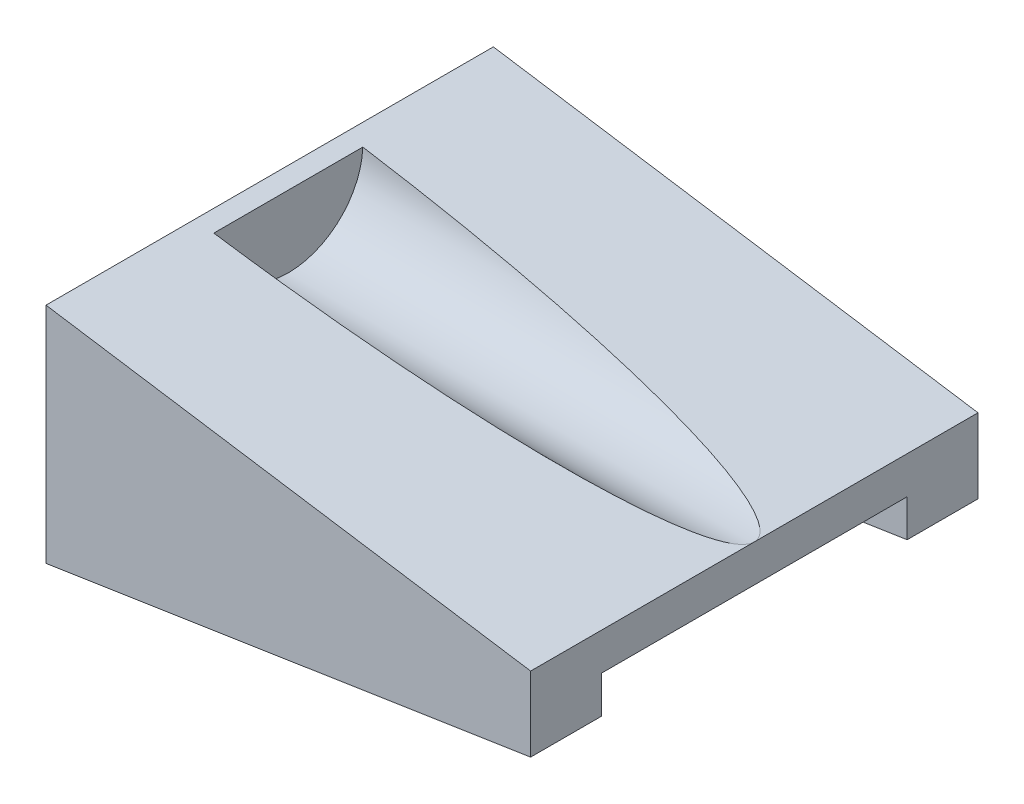
ISO-10303-21;
HEADER;
FILE_DESCRIPTION(('STEP AP214'),'2;1');
FILE_NAME('part.step','',(''),(''),'','','');
FILE_SCHEMA(('AUTOMOTIVE_DESIGN { 1 0 10303 214 1 1 1 1 }'));
ENDSEC;
DATA;
#1=APPLICATION_CONTEXT('core data for automotive mechanical design processes');
#2=APPLICATION_PROTOCOL_DEFINITION('international standard','automotive_design',2000,#1);
#3=PRODUCT_CONTEXT('',#1,'mechanical');
#4=PRODUCT('Part','Part','',(#3));
#5=PRODUCT_RELATED_PRODUCT_CATEGORY('part','',(#4));
#6=PRODUCT_DEFINITION_FORMATION('','',#4);
#7=PRODUCT_DEFINITION_CONTEXT('part definition',#1,'design');
#8=PRODUCT_DEFINITION('design','',#6,#7);
#9=PRODUCT_DEFINITION_SHAPE('','',#8);
#10=(LENGTH_UNIT() NAMED_UNIT(*) SI_UNIT(.MILLI.,.METRE.));
#11=(NAMED_UNIT(*) PLANE_ANGLE_UNIT() SI_UNIT($,.RADIAN.));
#12=(NAMED_UNIT(*) SI_UNIT($,.STERADIAN.) SOLID_ANGLE_UNIT());
#13=UNCERTAINTY_MEASURE_WITH_UNIT(LENGTH_MEASURE(1.E-05),#10,'distance_accuracy_value','');
#14=(GEOMETRIC_REPRESENTATION_CONTEXT(3) GLOBAL_UNCERTAINTY_ASSIGNED_CONTEXT((#13)) GLOBAL_UNIT_ASSIGNED_CONTEXT((#10,
#11,#12)) REPRESENTATION_CONTEXT('',''));
#15=CARTESIAN_POINT('',(0.,0.,0.));
#16=DIRECTION('',(0.,0.,1.));
#17=DIRECTION('',(1.,0.,0.));
#18=AXIS2_PLACEMENT_3D('',#15,#16,#17);
#19=CARTESIAN_POINT('',(0.,0.,0.));
#20=DIRECTION('',(0.,-1.,0.));
#21=DIRECTION('',(0.,0.,-1.));
#22=AXIS2_PLACEMENT_3D('',#19,#20,#21);
#23=PLANE('',#22);
#24=DIRECTION('',(0.,0.,1.));
#25=VECTOR('',#24,1.);
#26=CARTESIAN_POINT('',(-6.5,0.,6.));
#27=LINE('',#26,#25);
#28=CARTESIAN_POINT('',(-6.5,0.,-4.1));
#29=VERTEX_POINT('',#28);
#30=CARTESIAN_POINT('',(-6.5,0.,4.1));
#31=VERTEX_POINT('',#30);
#32=EDGE_CURVE('E159',#29,#31,#27,.T.);
#33=ORIENTED_EDGE('',*,*,#32,.F.);
#34=DIRECTION('',(-1.,0.,0.));
#35=VECTOR('',#34,1.);
#36=CARTESIAN_POINT('',(-6.5,0.,-4.1));
#37=LINE('',#36,#35);
#38=CARTESIAN_POINT('',(6.5,0.,-4.1));
#39=VERTEX_POINT('',#38);
#40=EDGE_CURVE('E109',#39,#29,#37,.T.);
#41=ORIENTED_EDGE('',*,*,#40,.F.);
#42=DIRECTION('',(0.,0.,-1.));
#43=VECTOR('',#42,1.);
#44=CARTESIAN_POINT('',(6.5,0.,6.));
#45=LINE('',#44,#43);
#46=CARTESIAN_POINT('',(6.5,0.,4.1));
#47=VERTEX_POINT('',#46);
#48=EDGE_CURVE('E161',#47,#39,#45,.T.);
#49=ORIENTED_EDGE('',*,*,#48,.F.);
#50=DIRECTION('',(1.,0.,0.));
#51=VECTOR('',#50,1.);
#52=CARTESIAN_POINT('',(-6.5,0.,4.1));
#53=LINE('',#52,#51);
#54=EDGE_CURVE('E164',#31,#47,#53,.T.);
#55=ORIENTED_EDGE('',*,*,#54,.F.);
#56=EDGE_LOOP('',(#33,#41,#49,#55));
#57=FACE_BOUND('',#56,.T.);
#58=ADVANCED_FACE('F33',(#57),#23,.T.);
#59=CARTESIAN_POINT('',(6.5,3.,6.));
#60=DIRECTION('',(-1.,0.,0.));
#61=DIRECTION('',(0.,0.,1.));
#62=AXIS2_PLACEMENT_3D('',#59,#60,#61);
#63=PLANE('',#62);
#64=DIRECTION('',(0.,-1.,0.));
#65=VECTOR('',#64,1.);
#66=CARTESIAN_POINT('',(6.5,3.,-6.));
#67=LINE('',#66,#65);
#68=CARTESIAN_POINT('',(6.5,0.999999999999999,-6.));
#69=VERTEX_POINT('',#68);
#70=CARTESIAN_POINT('',(6.5,-0.999999999999997,-6.));
#71=VERTEX_POINT('',#70);
#72=EDGE_CURVE('E132',#69,#71,#67,.T.);
#73=ORIENTED_EDGE('',*,*,#72,.F.);
#74=DIRECTION('',(0.,0.,1.));
#75=VECTOR('',#74,1.);
#76=CARTESIAN_POINT('',(6.5,0.999999999999999,6.));
#77=LINE('',#76,#75);
#78=CARTESIAN_POINT('',(6.49999999999999,1.,0.));
#79=VERTEX_POINT('',#78);
#80=EDGE_CURVE('E125',#69,#79,#77,.T.);
#81=ORIENTED_EDGE('',*,*,#80,.T.);
#82=CARTESIAN_POINT('',(6.5,0.999999999999999,6.));
#83=VERTEX_POINT('',#82);
#84=EDGE_CURVE('E118',#79,#83,#77,.T.);
#85=ORIENTED_EDGE('',*,*,#84,.T.);
#86=DIRECTION('',(0.,-1.,0.));
#87=VECTOR('',#86,1.);
#88=CARTESIAN_POINT('',(6.5,3.,6.));
#89=LINE('',#88,#87);
#90=CARTESIAN_POINT('',(6.5,-0.999999999999998,6.));
#91=VERTEX_POINT('',#90);
#92=EDGE_CURVE('E196',#83,#91,#89,.T.);
#93=ORIENTED_EDGE('',*,*,#92,.T.);
#94=DIRECTION('',(0.,0.,-1.));
#95=VECTOR('',#94,1.);
#96=CARTESIAN_POINT('',(6.5,-0.999999999999998,4.1));
#97=LINE('',#96,#95);
#98=CARTESIAN_POINT('',(6.5,-0.999999999999998,4.1));
#99=VERTEX_POINT('',#98);
#100=EDGE_CURVE('E184',#91,#99,#97,.T.);
#101=ORIENTED_EDGE('',*,*,#100,.T.);
#102=DIRECTION('',(0.,1.,0.));
#103=VECTOR('',#102,1.);
#104=CARTESIAN_POINT('',(6.5,-3.,4.1));
#105=LINE('',#104,#103);
#106=EDGE_CURVE('E147',#99,#47,#105,.T.);
#107=ORIENTED_EDGE('',*,*,#106,.T.);
#108=ORIENTED_EDGE('',*,*,#48,.T.);
#109=DIRECTION('',(0.,1.,0.));
#110=VECTOR('',#109,1.);
#111=CARTESIAN_POINT('',(6.5,-3.,-4.1));
#112=LINE('',#111,#110);
#113=CARTESIAN_POINT('',(6.5,-0.999999999999998,-4.1));
#114=VERTEX_POINT('',#113);
#115=EDGE_CURVE('E167',#114,#39,#112,.T.);
#116=ORIENTED_EDGE('',*,*,#115,.F.);
#117=DIRECTION('',(0.,0.,-1.));
#118=VECTOR('',#117,1.);
#119=CARTESIAN_POINT('',(6.5,-0.999999999999998,6.));
#120=LINE('',#119,#118);
#121=EDGE_CURVE('E126',#114,#71,#120,.T.);
#122=ORIENTED_EDGE('',*,*,#121,.T.);
#123=EDGE_LOOP('',(#73,#81,#85,#93,#101,#107,#108,#116,#122));
#124=FACE_BOUND('',#123,.T.);
#125=ADVANCED_FACE('F130',(#124),#63,.F.);
#126=CARTESIAN_POINT('',(-6.5,3.,-6.));
#127=DIRECTION('',(0.,0.,1.));
#128=DIRECTION('',(1.,0.,0.));
#129=AXIS2_PLACEMENT_3D('',#126,#127,#128);
#130=PLANE('',#129);
#131=DIRECTION('',(0.,-1.,0.));
#132=VECTOR('',#131,1.);
#133=CARTESIAN_POINT('',(-6.5,3.,-6.));
#134=LINE('',#133,#132);
#135=CARTESIAN_POINT('',(-6.5,3.,-6.));
#136=VERTEX_POINT('',#135);
#137=CARTESIAN_POINT('',(-6.5,-3.,-6.));
#138=VERTEX_POINT('',#137);
#139=EDGE_CURVE('E189',#136,#138,#134,.T.);
#140=ORIENTED_EDGE('',*,*,#139,.F.);
#141=DIRECTION('',(-0.988371697650618,0.152057184253938,0.));
#142=VECTOR('',#141,1.);
#143=CARTESIAN_POINT('',(-6.5000000000003,3.,-6.));
#144=LINE('',#143,#142);
#145=EDGE_CURVE('E182',#136,#69,#144,.F.);
#146=ORIENTED_EDGE('',*,*,#145,.T.);
#147=ORIENTED_EDGE('',*,*,#72,.T.);
#148=DIRECTION('',(0.988371697650618,0.152057184253938,0.));
#149=VECTOR('',#148,1.);
#150=CARTESIAN_POINT('',(-6.5000000000003,-3.,-6.));
#151=LINE('',#150,#149);
#152=EDGE_CURVE('E185',#71,#138,#151,.F.);
#153=ORIENTED_EDGE('',*,*,#152,.T.);
#154=EDGE_LOOP('',(#140,#146,#147,#153));
#155=FACE_BOUND('',#154,.T.);
#156=ADVANCED_FACE('F216',(#155),#130,.F.);
#157=CARTESIAN_POINT('',(-6.5,3.,6.));
#158=DIRECTION('',(1.,0.,0.));
#159=DIRECTION('',(0.,0.,-1.));
#160=AXIS2_PLACEMENT_3D('',#157,#158,#159);
#161=PLANE('',#160);
#162=ORIENTED_EDGE('',*,*,#139,.T.);
#163=DIRECTION('',(0.,0.,-1.));
#164=VECTOR('',#163,1.);
#165=CARTESIAN_POINT('',(-6.5,-3.,-6.));
#166=LINE('',#165,#164);
#167=CARTESIAN_POINT('',(-6.5,-3.,-4.1));
#168=VERTEX_POINT('',#167);
#169=EDGE_CURVE('E203',#168,#138,#166,.T.);
#170=ORIENTED_EDGE('',*,*,#169,.F.);
#171=DIRECTION('',(0.,1.,0.));
#172=VECTOR('',#171,1.);
#173=CARTESIAN_POINT('',(-6.5,-3.,-4.1));
#174=LINE('',#173,#172);
#175=EDGE_CURVE('E207',#168,#29,#174,.T.);
#176=ORIENTED_EDGE('',*,*,#175,.T.);
#177=ORIENTED_EDGE('',*,*,#32,.T.);
#178=DIRECTION('',(0.,1.,0.));
#179=VECTOR('',#178,1.);
#180=CARTESIAN_POINT('',(-6.5,-3.,4.1));
#181=LINE('',#180,#179);
#182=CARTESIAN_POINT('',(-6.5,-3.,4.1));
#183=VERTEX_POINT('',#182);
#184=EDGE_CURVE('E146',#183,#31,#181,.T.);
#185=ORIENTED_EDGE('',*,*,#184,.F.);
#186=DIRECTION('',(0.,0.,-1.));
#187=VECTOR('',#186,1.);
#188=CARTESIAN_POINT('',(-6.5,-3.,6.));
#189=LINE('',#188,#187);
#190=CARTESIAN_POINT('',(-6.5,-3.,6.));
#191=VERTEX_POINT('',#190);
#192=EDGE_CURVE('E156',#191,#183,#189,.T.);
#193=ORIENTED_EDGE('',*,*,#192,.F.);
#194=DIRECTION('',(0.,-1.,0.));
#195=VECTOR('',#194,1.);
#196=CARTESIAN_POINT('',(-6.5,3.,6.));
#197=LINE('',#196,#195);
#198=CARTESIAN_POINT('',(-6.5,3.,6.));
#199=VERTEX_POINT('',#198);
#200=EDGE_CURVE('E198',#199,#191,#197,.T.);
#201=ORIENTED_EDGE('',*,*,#200,.F.);
#202=DIRECTION('',(0.,0.,1.));
#203=VECTOR('',#202,1.);
#204=CARTESIAN_POINT('',(-6.5,3.,6.));
#205=LINE('',#204,#203);
#206=EDGE_CURVE('E174',#136,#199,#205,.T.);
#207=ORIENTED_EDGE('',*,*,#206,.F.);
#208=EDGE_LOOP('',(#162,#170,#176,#177,#185,#193,#201,#207));
#209=FACE_BOUND('',#208,.T.);
#210=ADVANCED_FACE('F154',(#209),#161,.F.);
#211=CARTESIAN_POINT('',(-6.5,3.,6.));
#212=DIRECTION('',(0.,0.,-1.));
#213=DIRECTION('',(-1.,0.,0.));
#214=AXIS2_PLACEMENT_3D('',#211,#212,#213);
#215=PLANE('',#214);
#216=ORIENTED_EDGE('',*,*,#92,.F.);
#217=DIRECTION('',(0.988371697650618,-0.152057184253938,0.));
#218=VECTOR('',#217,1.);
#219=CARTESIAN_POINT('',(-6.5000000000003,3.,6.));
#220=LINE('',#219,#218);
#221=EDGE_CURVE('E121',#83,#199,#220,.F.);
#222=ORIENTED_EDGE('',*,*,#221,.T.);
#223=ORIENTED_EDGE('',*,*,#200,.T.);
#224=DIRECTION('',(0.988371697650618,0.152057184253938,0.));
#225=VECTOR('',#224,1.);
#226=CARTESIAN_POINT('',(-6.5000000000003,-3.,6.));
#227=LINE('',#226,#225);
#228=EDGE_CURVE('E133',#191,#91,#227,.T.);
#229=ORIENTED_EDGE('',*,*,#228,.T.);
#230=EDGE_LOOP('',(#216,#222,#223,#229));
#231=FACE_BOUND('',#230,.T.);
#232=ADVANCED_FACE('F223',(#231),#215,.F.);
#233=CARTESIAN_POINT('',(-6.5,-3.,4.1));
#234=DIRECTION('',(0.,0.,1.));
#235=DIRECTION('',(1.,0.,0.));
#236=AXIS2_PLACEMENT_3D('',#233,#234,#235);
#237=PLANE('',#236);
#238=ORIENTED_EDGE('',*,*,#106,.F.);
#239=DIRECTION('',(-0.988371697650618,-0.152057184253938,0.));
#240=VECTOR('',#239,1.);
#241=CARTESIAN_POINT('',(-6.5000000000003,-3.,4.1));
#242=LINE('',#241,#240);
#243=EDGE_CURVE('E41',#99,#183,#242,.T.);
#244=ORIENTED_EDGE('',*,*,#243,.T.);
#245=ORIENTED_EDGE('',*,*,#184,.T.);
#246=ORIENTED_EDGE('',*,*,#54,.T.);
#247=EDGE_LOOP('',(#238,#244,#245,#246));
#248=FACE_BOUND('',#247,.T.);
#249=ADVANCED_FACE('F144',(#248),#237,.F.);
#250=CARTESIAN_POINT('',(-6.5,-3.,-4.1));
#251=DIRECTION('',(0.,0.,-1.));
#252=DIRECTION('',(-1.,0.,0.));
#253=AXIS2_PLACEMENT_3D('',#250,#251,#252);
#254=PLANE('',#253);
#255=ORIENTED_EDGE('',*,*,#175,.F.);
#256=DIRECTION('',(-0.988371697650618,-0.152057184253938,0.));
#257=VECTOR('',#256,1.);
#258=CARTESIAN_POINT('',(-6.5000000000003,-3.,-4.1));
#259=LINE('',#258,#257);
#260=EDGE_CURVE('E55',#168,#114,#259,.F.);
#261=ORIENTED_EDGE('',*,*,#260,.T.);
#262=ORIENTED_EDGE('',*,*,#115,.T.);
#263=ORIENTED_EDGE('',*,*,#40,.T.);
#264=EDGE_LOOP('',(#255,#261,#262,#263));
#265=FACE_BOUND('',#264,.T.);
#266=ADVANCED_FACE('F212',(#265),#254,.F.);
#267=CARTESIAN_POINT('',(-6.5000000000003,3.,0.));
#268=DIRECTION('',(-0.152057184253938,-0.988371697650618,0.));
#269=DIRECTION('',(0.,0.,-1.));
#270=AXIS2_PLACEMENT_3D('',#267,#268,#269);
#271=PLANE('',#270);
#272=CARTESIAN_POINT('',(-6.5000000000003,3.,0.));
#273=DIRECTION('',(-0.152057184253938,-0.988371697650618,0.));
#274=DIRECTION('',(-0.988371697650618,0.152057184253938,0.));
#275=AXIS2_PLACEMENT_3D('',#272,#273,#274);
#276=ELLIPSE('',#275,13.1529464379662,2.);
#277=CARTESIAN_POINT('',(-6.,2.92307692307688,1.99852016257947));
#278=VERTEX_POINT('',#277);
#279=EDGE_CURVE('E11',#278,#79,#276,.F.);
#280=ORIENTED_EDGE('',*,*,#279,.F.);
#281=DIRECTION('',(0.,0.,1.));
#282=VECTOR('',#281,1.);
#283=CARTESIAN_POINT('',(-6.,2.92307692307688,0.));
#284=LINE('',#283,#282);
#285=CARTESIAN_POINT('',(-6.,2.92307692307688,-1.99852016257947));
#286=VERTEX_POINT('',#285);
#287=EDGE_CURVE('E104',#278,#286,#284,.F.);
#288=ORIENTED_EDGE('',*,*,#287,.T.);
#289=CARTESIAN_POINT('',(-6.5000000000003,3.,0.));
#290=DIRECTION('',(-0.152057184253938,-0.988371697650618,0.));
#291=DIRECTION('',(-0.988371697650618,0.152057184253938,0.));
#292=AXIS2_PLACEMENT_3D('',#289,#290,#291);
#293=ELLIPSE('',#292,13.1529464379662,2.);
#294=EDGE_CURVE('E113',#286,#79,#293,.T.);
#295=ORIENTED_EDGE('',*,*,#294,.T.);
#296=ORIENTED_EDGE('',*,*,#80,.F.);
#297=ORIENTED_EDGE('',*,*,#145,.F.);
#298=ORIENTED_EDGE('',*,*,#206,.T.);
#299=ORIENTED_EDGE('',*,*,#221,.F.);
#300=ORIENTED_EDGE('',*,*,#84,.F.);
#301=EDGE_LOOP('',(#280,#288,#295,#296,#297,#298,#299,#300));
#302=FACE_BOUND('',#301,.T.);
#303=ADVANCED_FACE('F116',(#302),#271,.F.);
#304=CARTESIAN_POINT('',(-6.5000000000003,-3.,0.));
#305=DIRECTION('',(-0.152057184253938,0.988371697650618,0.));
#306=DIRECTION('',(0.,0.,1.));
#307=AXIS2_PLACEMENT_3D('',#304,#305,#306);
#308=PLANE('',#307);
#309=ORIENTED_EDGE('',*,*,#152,.F.);
#310=ORIENTED_EDGE('',*,*,#121,.F.);
#311=ORIENTED_EDGE('',*,*,#260,.F.);
#312=ORIENTED_EDGE('',*,*,#169,.T.);
#313=EDGE_LOOP('',(#309,#310,#311,#312));
#314=FACE_BOUND('',#313,.T.);
#315=ADVANCED_FACE('F205',(#314),#308,.F.);
#316=CARTESIAN_POINT('',(-6.5000000000003,-3.,0.));
#317=DIRECTION('',(0.152057184253938,-0.988371697650618,0.));
#318=DIRECTION('',(0.,0.,-1.));
#319=AXIS2_PLACEMENT_3D('',#316,#317,#318);
#320=PLANE('',#319);
#321=ORIENTED_EDGE('',*,*,#243,.F.);
#322=ORIENTED_EDGE('',*,*,#100,.F.);
#323=ORIENTED_EDGE('',*,*,#228,.F.);
#324=ORIENTED_EDGE('',*,*,#192,.T.);
#325=EDGE_LOOP('',(#321,#322,#323,#324));
#326=FACE_BOUND('',#325,.T.);
#327=ADVANCED_FACE('F35',(#326),#320,.T.);
#328=CARTESIAN_POINT('',(6.50105,3.,0.));
#329=DIRECTION('',(-1.,0.,0.));
#330=DIRECTION('',(0.,0.,1.));
#331=AXIS2_PLACEMENT_3D('',#328,#329,#330);
#332=CYLINDRICAL_SURFACE('',#331,2.);
#333=CARTESIAN_POINT('',(-6.,3.,0.));
#334=DIRECTION('',(-1.,0.,0.));
#335=DIRECTION('',(0.,0.,1.));
#336=AXIS2_PLACEMENT_3D('',#333,#334,#335);
#337=CIRCLE('',#336,2.);
#338=EDGE_CURVE('E47',#286,#278,#337,.T.);
#339=ORIENTED_EDGE('',*,*,#338,.T.);
#340=ORIENTED_EDGE('',*,*,#279,.T.);
#341=ORIENTED_EDGE('',*,*,#294,.F.);
#342=EDGE_LOOP('',(#339,#340,#341));
#343=FACE_BOUND('',#342,.T.);
#344=ADVANCED_FACE('F112',(#343),#332,.F.);
#345=CARTESIAN_POINT('',(-6.,3.,0.));
#346=DIRECTION('',(-1.,0.,0.));
#347=DIRECTION('',(0.,0.,1.));
#348=AXIS2_PLACEMENT_3D('',#345,#346,#347);
#349=PLANE('',#348);
#350=ORIENTED_EDGE('',*,*,#338,.F.);
#351=ORIENTED_EDGE('',*,*,#287,.F.);
#352=EDGE_LOOP('',(#350,#351));
#353=FACE_BOUND('',#352,.T.);
#354=ADVANCED_FACE('F105',(#353),#349,.F.);
#355=CLOSED_SHELL('',(#58,#125,#156,#210,#232,#249,#266,#303,#315,#327,#344,#354));
#356=MANIFOLD_SOLID_BREP('B2',#355);
#357=ADVANCED_BREP_SHAPE_REPRESENTATION('',(#18,#356),#14);
#358=SHAPE_DEFINITION_REPRESENTATION(#9,#357);
ENDSEC;
END-ISO-10303-21;
